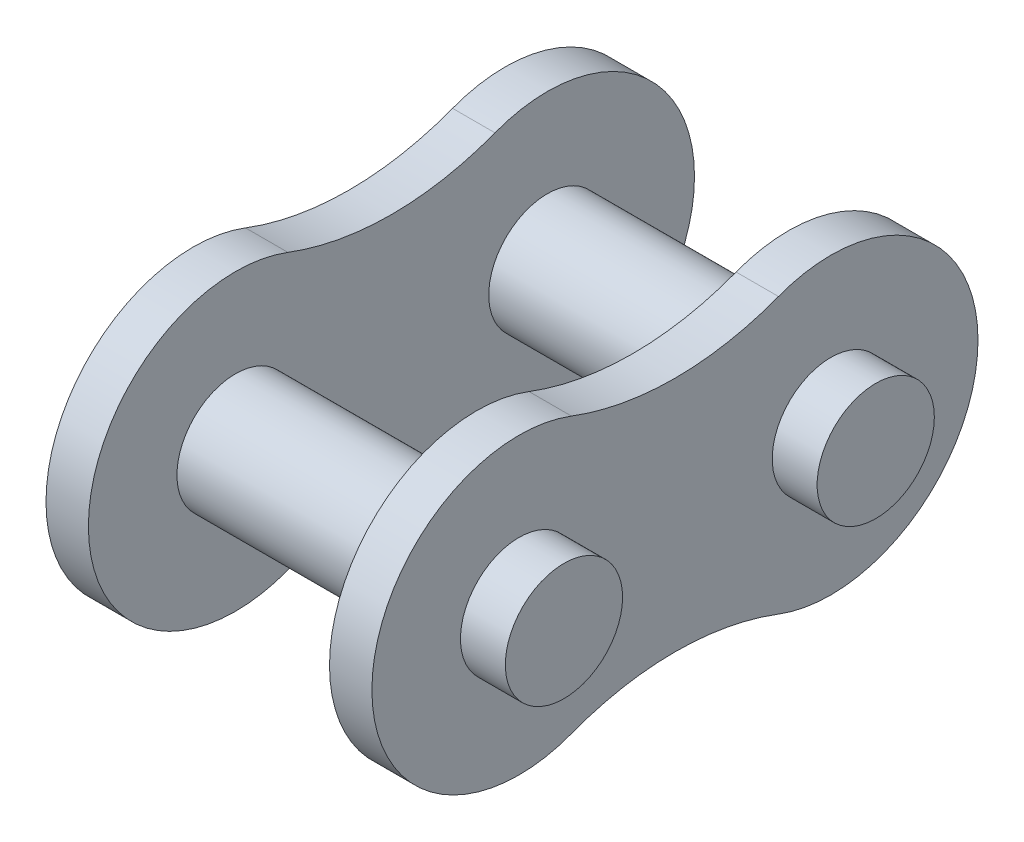
ISO-10303-21;
HEADER;
FILE_DESCRIPTION(('STEP AP214'),'2;1');
FILE_NAME('part.step','',(''),(''),'','','');
FILE_SCHEMA(('AUTOMOTIVE_DESIGN { 1 0 10303 214 1 1 1 1 }'));
ENDSEC;
DATA;
#1=APPLICATION_CONTEXT('core data for automotive mechanical design processes');
#2=APPLICATION_PROTOCOL_DEFINITION('international standard','automotive_design',2000,#1);
#3=PRODUCT_CONTEXT('',#1,'mechanical');
#4=PRODUCT('Part','Part','',(#3));
#5=PRODUCT_RELATED_PRODUCT_CATEGORY('part','',(#4));
#6=PRODUCT_DEFINITION_FORMATION('','',#4);
#7=PRODUCT_DEFINITION_CONTEXT('part definition',#1,'design');
#8=PRODUCT_DEFINITION('design','',#6,#7);
#9=PRODUCT_DEFINITION_SHAPE('','',#8);
#10=(LENGTH_UNIT() NAMED_UNIT(*) SI_UNIT(.MILLI.,.METRE.));
#11=(NAMED_UNIT(*) PLANE_ANGLE_UNIT() SI_UNIT($,.RADIAN.));
#12=(NAMED_UNIT(*) SI_UNIT($,.STERADIAN.) SOLID_ANGLE_UNIT());
#13=UNCERTAINTY_MEASURE_WITH_UNIT(LENGTH_MEASURE(1.E-05),#10,'distance_accuracy_value','');
#14=(GEOMETRIC_REPRESENTATION_CONTEXT(3) GLOBAL_UNCERTAINTY_ASSIGNED_CONTEXT((#13)) GLOBAL_UNIT_ASSIGNED_CONTEXT((#10,
#11,#12)) REPRESENTATION_CONTEXT('',''));
#15=CARTESIAN_POINT('',(0.,0.,0.));
#16=DIRECTION('',(0.,0.,1.));
#17=DIRECTION('',(1.,0.,0.));
#18=AXIS2_PLACEMENT_3D('',#15,#16,#17);
#19=CARTESIAN_POINT('',(-4.9784,0.,0.));
#20=DIRECTION('',(1.,0.,0.));
#21=DIRECTION('',(0.,0.,-1.));
#22=AXIS2_PLACEMENT_3D('',#19,#20,#21);
#23=CYLINDRICAL_SURFACE('',#22,4.4958);
#24=CARTESIAN_POINT('',(-3.683,0.,0.));
#25=DIRECTION('',(1.,0.,0.));
#26=DIRECTION('',(0.,0.,-1.));
#27=AXIS2_PLACEMENT_3D('',#24,#25,#26);
#28=CIRCLE('',#27,4.4958);
#29=CARTESIAN_POINT('',(-3.683,4.201625823671,-1.59954933586338));
#30=VERTEX_POINT('',#29);
#31=CARTESIAN_POINT('',(-3.683,-4.201625823671,-1.59954933586338));
#32=VERTEX_POINT('',#31);
#33=EDGE_CURVE('E144',#30,#32,#28,.T.);
#34=ORIENTED_EDGE('',*,*,#33,.F.);
#35=DIRECTION('',(1.,0.,0.));
#36=VECTOR('',#35,1.);
#37=CARTESIAN_POINT('',(-4.9784,4.201625823671,-1.59954933586338));
#38=LINE('',#37,#36);
#39=CARTESIAN_POINT('',(-4.9784,4.201625823671,-1.59954933586338));
#40=VERTEX_POINT('',#39);
#41=EDGE_CURVE('E13',#40,#30,#38,.T.);
#42=ORIENTED_EDGE('',*,*,#41,.F.);
#43=CARTESIAN_POINT('',(-4.9784,0.,0.));
#44=DIRECTION('',(1.,0.,0.));
#45=DIRECTION('',(0.,0.,-1.));
#46=AXIS2_PLACEMENT_3D('',#43,#44,#45);
#47=CIRCLE('',#46,4.4958);
#48=CARTESIAN_POINT('',(-4.9784,-4.201625823671,-1.59954933586338));
#49=VERTEX_POINT('',#48);
#50=EDGE_CURVE('E132',#40,#49,#47,.T.);
#51=ORIENTED_EDGE('',*,*,#50,.T.);
#52=DIRECTION('',(1.,0.,0.));
#53=VECTOR('',#52,1.);
#54=CARTESIAN_POINT('',(-4.9784,-4.201625823671,-1.59954933586338));
#55=LINE('',#54,#53);
#56=EDGE_CURVE('E75',#49,#32,#55,.T.);
#57=ORIENTED_EDGE('',*,*,#56,.T.);
#58=EDGE_LOOP('',(#34,#42,#51,#57));
#59=FACE_BOUND('',#58,.T.);
#60=ADVANCED_FACE('F72',(#59),#23,.T.);
#61=CARTESIAN_POINT('',(-4.9784,12.5099254749978,-4.7625));
#62=DIRECTION('',(1.,0.,0.));
#63=DIRECTION('',(0.,0.,-1.));
#64=AXIS2_PLACEMENT_3D('',#61,#62,#63);
#65=CYLINDRICAL_SURFACE('',#64,8.89);
#66=CARTESIAN_POINT('',(-3.683,12.5099254749978,-4.7625));
#67=DIRECTION('',(1.,0.,0.));
#68=DIRECTION('',(0.,0.,-1.));
#69=AXIS2_PLACEMENT_3D('',#66,#67,#68);
#70=CIRCLE('',#69,8.89);
#71=CARTESIAN_POINT('',(-3.683,4.201625823671,-7.92545066413662));
#72=VERTEX_POINT('',#71);
#73=EDGE_CURVE('E150',#30,#72,#70,.T.);
#74=ORIENTED_EDGE('',*,*,#73,.T.);
#75=DIRECTION('',(1.,0.,0.));
#76=VECTOR('',#75,1.);
#77=CARTESIAN_POINT('',(-4.9784,4.201625823671,-7.92545066413662));
#78=LINE('',#77,#76);
#79=CARTESIAN_POINT('',(-4.9784,4.201625823671,-7.92545066413662));
#80=VERTEX_POINT('',#79);
#81=EDGE_CURVE('E81',#80,#72,#78,.T.);
#82=ORIENTED_EDGE('',*,*,#81,.F.);
#83=CARTESIAN_POINT('',(-4.9784,12.5099254749978,-4.7625));
#84=DIRECTION('',(1.,0.,0.));
#85=DIRECTION('',(0.,0.,-1.));
#86=AXIS2_PLACEMENT_3D('',#83,#84,#85);
#87=CIRCLE('',#86,8.89);
#88=EDGE_CURVE('E129',#40,#80,#87,.T.);
#89=ORIENTED_EDGE('',*,*,#88,.F.);
#90=ORIENTED_EDGE('',*,*,#41,.T.);
#91=EDGE_LOOP('',(#74,#82,#89,#90));
#92=FACE_BOUND('',#91,.T.);
#93=ADVANCED_FACE('F172',(#92),#65,.F.);
#94=CARTESIAN_POINT('',(-4.9784,0.,-9.525));
#95=DIRECTION('',(1.,0.,0.));
#96=DIRECTION('',(0.,0.,-1.));
#97=AXIS2_PLACEMENT_3D('',#94,#95,#96);
#98=CYLINDRICAL_SURFACE('',#97,4.4958);
#99=CARTESIAN_POINT('',(-3.683,0.,-9.525));
#100=DIRECTION('',(1.,0.,0.));
#101=DIRECTION('',(0.,0.,-1.));
#102=AXIS2_PLACEMENT_3D('',#99,#100,#101);
#103=CIRCLE('',#102,4.4958);
#104=CARTESIAN_POINT('',(-3.683,-4.201625823671,-7.92545066413662));
#105=VERTEX_POINT('',#104);
#106=EDGE_CURVE('E122',#105,#72,#103,.T.);
#107=ORIENTED_EDGE('',*,*,#106,.F.);
#108=DIRECTION('',(1.,0.,0.));
#109=VECTOR('',#108,1.);
#110=CARTESIAN_POINT('',(-4.9784,-4.201625823671,-7.92545066413662));
#111=LINE('',#110,#109);
#112=CARTESIAN_POINT('',(-4.9784,-4.201625823671,-7.92545066413662));
#113=VERTEX_POINT('',#112);
#114=EDGE_CURVE('E117',#113,#105,#111,.T.);
#115=ORIENTED_EDGE('',*,*,#114,.F.);
#116=CARTESIAN_POINT('',(-4.9784,0.,-9.525));
#117=DIRECTION('',(1.,0.,0.));
#118=DIRECTION('',(0.,0.,-1.));
#119=AXIS2_PLACEMENT_3D('',#116,#117,#118);
#120=CIRCLE('',#119,4.4958);
#121=EDGE_CURVE('E120',#113,#80,#120,.T.);
#122=ORIENTED_EDGE('',*,*,#121,.T.);
#123=ORIENTED_EDGE('',*,*,#81,.T.);
#124=EDGE_LOOP('',(#107,#115,#122,#123));
#125=FACE_BOUND('',#124,.T.);
#126=ADVANCED_FACE('F119',(#125),#98,.T.);
#127=CARTESIAN_POINT('',(-4.9784,0.,-9.525));
#128=DIRECTION('',(1.,0.,0.));
#129=DIRECTION('',(0.,0.,-1.));
#130=AXIS2_PLACEMENT_3D('',#127,#128,#129);
#131=CYLINDRICAL_SURFACE('',#130,1.7907);
#132=CARTESIAN_POINT('',(-4.9784,0.,-9.525));
#133=DIRECTION('',(1.,0.,0.));
#134=DIRECTION('',(0.,0.,-1.));
#135=AXIS2_PLACEMENT_3D('',#132,#133,#134);
#136=CIRCLE('',#135,1.7907);
#137=CARTESIAN_POINT('',(-4.9784,0.,-11.3157));
#138=VERTEX_POINT('',#137);
#139=EDGE_CURVE('E138',#138,#138,#136,.T.);
#140=ORIENTED_EDGE('',*,*,#139,.F.);
#141=EDGE_LOOP('',(#140));
#142=FACE_BOUND('',#141,.T.);
#143=CARTESIAN_POINT('',(-3.683,0.,-9.525));
#144=DIRECTION('',(1.,0.,0.));
#145=DIRECTION('',(0.,0.,-1.));
#146=AXIS2_PLACEMENT_3D('',#143,#144,#145);
#147=CIRCLE('',#146,1.7907);
#148=CARTESIAN_POINT('',(-3.683,0.,-11.3157));
#149=VERTEX_POINT('',#148);
#150=EDGE_CURVE('E152',#149,#149,#147,.T.);
#151=ORIENTED_EDGE('',*,*,#150,.T.);
#152=EDGE_LOOP('',(#151));
#153=FACE_BOUND('',#152,.T.);
#154=ADVANCED_FACE('F180',(#142,#153),#131,.F.);
#155=CARTESIAN_POINT('',(-4.9784,-12.5099254749978,-4.7625));
#156=DIRECTION('',(1.,0.,0.));
#157=DIRECTION('',(0.,0.,-1.));
#158=AXIS2_PLACEMENT_3D('',#155,#156,#157);
#159=CYLINDRICAL_SURFACE('',#158,8.89);
#160=CARTESIAN_POINT('',(-3.683,-12.5099254749978,-4.7625));
#161=DIRECTION('',(1.,0.,0.));
#162=DIRECTION('',(0.,0.,-1.));
#163=AXIS2_PLACEMENT_3D('',#160,#161,#162);
#164=CIRCLE('',#163,8.89);
#165=EDGE_CURVE('E147',#32,#105,#164,.F.);
#166=ORIENTED_EDGE('',*,*,#165,.F.);
#167=ORIENTED_EDGE('',*,*,#56,.F.);
#168=CARTESIAN_POINT('',(-4.9784,-12.5099254749978,-4.7625));
#169=DIRECTION('',(1.,0.,0.));
#170=DIRECTION('',(0.,0.,-1.));
#171=AXIS2_PLACEMENT_3D('',#168,#169,#170);
#172=CIRCLE('',#171,8.89);
#173=EDGE_CURVE('E128',#49,#113,#172,.F.);
#174=ORIENTED_EDGE('',*,*,#173,.T.);
#175=ORIENTED_EDGE('',*,*,#114,.T.);
#176=EDGE_LOOP('',(#166,#167,#174,#175));
#177=FACE_BOUND('',#176,.T.);
#178=ADVANCED_FACE('F131',(#177),#159,.F.);
#179=CARTESIAN_POINT('',(-4.9784,0.,0.));
#180=DIRECTION('',(1.,0.,0.));
#181=DIRECTION('',(0.,0.,-1.));
#182=AXIS2_PLACEMENT_3D('',#179,#180,#181);
#183=CYLINDRICAL_SURFACE('',#182,1.7907);
#184=CARTESIAN_POINT('',(-4.9784,0.,0.));
#185=DIRECTION('',(1.,0.,0.));
#186=DIRECTION('',(0.,0.,-1.));
#187=AXIS2_PLACEMENT_3D('',#184,#185,#186);
#188=CIRCLE('',#187,1.7907);
#189=CARTESIAN_POINT('',(-4.9784,0.,-1.7907));
#190=VERTEX_POINT('',#189);
#191=EDGE_CURVE('E141',#190,#190,#188,.T.);
#192=ORIENTED_EDGE('',*,*,#191,.F.);
#193=EDGE_LOOP('',(#192));
#194=FACE_BOUND('',#193,.T.);
#195=CARTESIAN_POINT('',(-3.683,0.,0.));
#196=DIRECTION('',(1.,0.,0.));
#197=DIRECTION('',(0.,0.,-1.));
#198=AXIS2_PLACEMENT_3D('',#195,#196,#197);
#199=CIRCLE('',#198,1.7907);
#200=CARTESIAN_POINT('',(-3.683,0.,-1.7907));
#201=VERTEX_POINT('',#200);
#202=EDGE_CURVE('E134',#201,#201,#199,.T.);
#203=ORIENTED_EDGE('',*,*,#202,.T.);
#204=EDGE_LOOP('',(#203));
#205=FACE_BOUND('',#204,.T.);
#206=ADVANCED_FACE('F159',(#194,#205),#183,.F.);
#207=CARTESIAN_POINT('',(-4.9784,0.,0.));
#208=DIRECTION('',(1.,0.,0.));
#209=DIRECTION('',(0.,0.,-1.));
#210=AXIS2_PLACEMENT_3D('',#207,#208,#209);
#211=PLANE('',#210);
#212=ORIENTED_EDGE('',*,*,#50,.F.);
#213=ORIENTED_EDGE('',*,*,#88,.T.);
#214=ORIENTED_EDGE('',*,*,#121,.F.);
#215=ORIENTED_EDGE('',*,*,#173,.F.);
#216=EDGE_LOOP('',(#212,#213,#214,#215));
#217=FACE_BOUND('',#216,.T.);
#218=ORIENTED_EDGE('',*,*,#139,.T.);
#219=EDGE_LOOP('',(#218));
#220=FACE_BOUND('',#219,.T.);
#221=ORIENTED_EDGE('',*,*,#191,.T.);
#222=EDGE_LOOP('',(#221));
#223=FACE_BOUND('',#222,.T.);
#224=ADVANCED_FACE('F126',(#217,#220,#223),#211,.F.);
#225=CARTESIAN_POINT('',(-3.683,0.,0.));
#226=DIRECTION('',(1.,0.,0.));
#227=DIRECTION('',(0.,0.,-1.));
#228=AXIS2_PLACEMENT_3D('',#225,#226,#227);
#229=PLANE('',#228);
#230=ORIENTED_EDGE('',*,*,#33,.T.);
#231=ORIENTED_EDGE('',*,*,#165,.T.);
#232=ORIENTED_EDGE('',*,*,#106,.T.);
#233=ORIENTED_EDGE('',*,*,#73,.F.);
#234=EDGE_LOOP('',(#230,#231,#232,#233));
#235=FACE_BOUND('',#234,.T.);
#236=ORIENTED_EDGE('',*,*,#150,.F.);
#237=EDGE_LOOP('',(#236));
#238=FACE_BOUND('',#237,.T.);
#239=ORIENTED_EDGE('',*,*,#202,.F.);
#240=EDGE_LOOP('',(#239));
#241=FACE_BOUND('',#240,.T.);
#242=ADVANCED_FACE('F161',(#235,#238,#241),#229,.T.);
#243=CLOSED_SHELL('',(#60,#93,#126,#154,#178,#206,#224,#242));
#244=MANIFOLD_SOLID_BREP('B2',#243);
#245=CARTESIAN_POINT('',(3.683,0.,0.));
#246=DIRECTION('',(1.,0.,0.));
#247=DIRECTION('',(0.,0.,-1.));
#248=AXIS2_PLACEMENT_3D('',#245,#246,#247);
#249=PLANE('',#248);
#250=CARTESIAN_POINT('',(3.683,0.,0.));
#251=DIRECTION('',(1.,0.,0.));
#252=DIRECTION('',(0.,0.,-1.));
#253=AXIS2_PLACEMENT_3D('',#250,#251,#252);
#254=CIRCLE('',#253,4.4958);
#255=CARTESIAN_POINT('',(3.683,4.201625823671,-1.59954933586338));
#256=VERTEX_POINT('',#255);
#257=CARTESIAN_POINT('',(3.683,-4.201625823671,-1.59954933586338));
#258=VERTEX_POINT('',#257);
#259=EDGE_CURVE('E322',#256,#258,#254,.T.);
#260=ORIENTED_EDGE('',*,*,#259,.F.);
#261=CARTESIAN_POINT('',(3.683,12.5099254749978,-4.7625));
#262=DIRECTION('',(1.,0.,0.));
#263=DIRECTION('',(0.,0.,-1.));
#264=AXIS2_PLACEMENT_3D('',#261,#262,#263);
#265=CIRCLE('',#264,8.89);
#266=CARTESIAN_POINT('',(3.683,4.201625823671,-7.92545066413662));
#267=VERTEX_POINT('',#266);
#268=EDGE_CURVE('E327',#256,#267,#265,.T.);
#269=ORIENTED_EDGE('',*,*,#268,.T.);
#270=CARTESIAN_POINT('',(3.683,0.,-9.525));
#271=DIRECTION('',(1.,0.,0.));
#272=DIRECTION('',(0.,0.,-1.));
#273=AXIS2_PLACEMENT_3D('',#270,#271,#272);
#274=CIRCLE('',#273,4.4958);
#275=CARTESIAN_POINT('',(3.683,-4.201625823671,-7.92545066413662));
#276=VERTEX_POINT('',#275);
#277=EDGE_CURVE('E325',#276,#267,#274,.T.);
#278=ORIENTED_EDGE('',*,*,#277,.F.);
#279=CARTESIAN_POINT('',(3.683,-12.5099254749978,-4.7625));
#280=DIRECTION('',(1.,0.,0.));
#281=DIRECTION('',(0.,0.,-1.));
#282=AXIS2_PLACEMENT_3D('',#279,#280,#281);
#283=CIRCLE('',#282,8.89);
#284=EDGE_CURVE('E313',#258,#276,#283,.F.);
#285=ORIENTED_EDGE('',*,*,#284,.F.);
#286=EDGE_LOOP('',(#260,#269,#278,#285));
#287=FACE_BOUND('',#286,.T.);
#288=ADVANCED_FACE('F258',(#287),#249,.F.);
#289=CARTESIAN_POINT('',(4.9784,0.,-9.525));
#290=DIRECTION('',(-1.,0.,0.));
#291=DIRECTION('',(0.,0.,1.));
#292=AXIS2_PLACEMENT_3D('',#289,#290,#291);
#293=CYLINDRICAL_SURFACE('',#292,4.4958);
#294=ORIENTED_EDGE('',*,*,#277,.T.);
#295=DIRECTION('',(-1.,0.,0.));
#296=VECTOR('',#295,1.);
#297=CARTESIAN_POINT('',(4.9784,4.201625823671,-7.92545066413662));
#298=LINE('',#297,#296);
#299=CARTESIAN_POINT('',(4.9784,4.201625823671,-7.92545066413662));
#300=VERTEX_POINT('',#299);
#301=EDGE_CURVE('E290',#300,#267,#298,.T.);
#302=ORIENTED_EDGE('',*,*,#301,.F.);
#303=CARTESIAN_POINT('',(4.9784,0.,-9.525));
#304=DIRECTION('',(1.,0.,0.));
#305=DIRECTION('',(0.,0.,-1.));
#306=AXIS2_PLACEMENT_3D('',#303,#304,#305);
#307=CIRCLE('',#306,4.4958);
#308=CARTESIAN_POINT('',(4.9784,-4.201625823671,-7.92545066413662));
#309=VERTEX_POINT('',#308);
#310=EDGE_CURVE('E307',#309,#300,#307,.T.);
#311=ORIENTED_EDGE('',*,*,#310,.F.);
#312=DIRECTION('',(-1.,0.,0.));
#313=VECTOR('',#312,1.);
#314=CARTESIAN_POINT('',(4.9784,-4.201625823671,-7.92545066413662));
#315=LINE('',#314,#313);
#316=EDGE_CURVE('E267',#309,#276,#315,.T.);
#317=ORIENTED_EDGE('',*,*,#316,.T.);
#318=EDGE_LOOP('',(#294,#302,#311,#317));
#319=FACE_BOUND('',#318,.T.);
#320=ADVANCED_FACE('F316',(#319),#293,.T.);
#321=CARTESIAN_POINT('',(4.9784,-12.5099254749978,-4.7625));
#322=DIRECTION('',(-1.,0.,0.));
#323=DIRECTION('',(0.,0.,1.));
#324=AXIS2_PLACEMENT_3D('',#321,#322,#323);
#325=CYLINDRICAL_SURFACE('',#324,8.89);
#326=ORIENTED_EDGE('',*,*,#284,.T.);
#327=ORIENTED_EDGE('',*,*,#316,.F.);
#328=CARTESIAN_POINT('',(4.9784,-12.5099254749978,-4.7625));
#329=DIRECTION('',(1.,0.,0.));
#330=DIRECTION('',(0.,0.,-1.));
#331=AXIS2_PLACEMENT_3D('',#328,#329,#330);
#332=CIRCLE('',#331,8.89);
#333=CARTESIAN_POINT('',(4.9784,-4.201625823671,-1.59954933586338));
#334=VERTEX_POINT('',#333);
#335=EDGE_CURVE('E301',#334,#309,#332,.F.);
#336=ORIENTED_EDGE('',*,*,#335,.F.);
#337=DIRECTION('',(-1.,0.,0.));
#338=VECTOR('',#337,1.);
#339=CARTESIAN_POINT('',(4.9784,-4.201625823671,-1.59954933586338));
#340=LINE('',#339,#338);
#341=EDGE_CURVE('E70',#334,#258,#340,.T.);
#342=ORIENTED_EDGE('',*,*,#341,.T.);
#343=EDGE_LOOP('',(#326,#327,#336,#342));
#344=FACE_BOUND('',#343,.T.);
#345=ADVANCED_FACE('F312',(#344),#325,.F.);
#346=CARTESIAN_POINT('',(4.9784,0.,0.));
#347=DIRECTION('',(-1.,0.,0.));
#348=DIRECTION('',(0.,0.,1.));
#349=AXIS2_PLACEMENT_3D('',#346,#347,#348);
#350=CYLINDRICAL_SURFACE('',#349,4.4958);
#351=ORIENTED_EDGE('',*,*,#259,.T.);
#352=ORIENTED_EDGE('',*,*,#341,.F.);
#353=CARTESIAN_POINT('',(4.9784,0.,0.));
#354=DIRECTION('',(1.,0.,0.));
#355=DIRECTION('',(0.,0.,-1.));
#356=AXIS2_PLACEMENT_3D('',#353,#354,#355);
#357=CIRCLE('',#356,4.4958);
#358=CARTESIAN_POINT('',(4.9784,4.201625823671,-1.59954933586338));
#359=VERTEX_POINT('',#358);
#360=EDGE_CURVE('E308',#359,#334,#357,.T.);
#361=ORIENTED_EDGE('',*,*,#360,.F.);
#362=DIRECTION('',(-1.,0.,0.));
#363=VECTOR('',#362,1.);
#364=CARTESIAN_POINT('',(4.9784,4.201625823671,-1.59954933586338));
#365=LINE('',#364,#363);
#366=EDGE_CURVE('E275',#359,#256,#365,.T.);
#367=ORIENTED_EDGE('',*,*,#366,.T.);
#368=EDGE_LOOP('',(#351,#352,#361,#367));
#369=FACE_BOUND('',#368,.T.);
#370=ADVANCED_FACE('F260',(#369),#350,.T.);
#371=CARTESIAN_POINT('',(4.9784,12.5099254749978,-4.7625));
#372=DIRECTION('',(-1.,0.,0.));
#373=DIRECTION('',(0.,0.,1.));
#374=AXIS2_PLACEMENT_3D('',#371,#372,#373);
#375=CYLINDRICAL_SURFACE('',#374,8.89);
#376=ORIENTED_EDGE('',*,*,#268,.F.);
#377=ORIENTED_EDGE('',*,*,#366,.F.);
#378=CARTESIAN_POINT('',(4.9784,12.5099254749978,-4.7625));
#379=DIRECTION('',(1.,0.,0.));
#380=DIRECTION('',(0.,0.,-1.));
#381=AXIS2_PLACEMENT_3D('',#378,#379,#380);
#382=CIRCLE('',#381,8.89);
#383=EDGE_CURVE('E317',#359,#300,#382,.T.);
#384=ORIENTED_EDGE('',*,*,#383,.T.);
#385=ORIENTED_EDGE('',*,*,#301,.T.);
#386=EDGE_LOOP('',(#376,#377,#384,#385));
#387=FACE_BOUND('',#386,.T.);
#388=ADVANCED_FACE('F332',(#387),#375,.F.);
#389=CARTESIAN_POINT('',(4.9784,0.,0.));
#390=DIRECTION('',(1.,0.,0.));
#391=DIRECTION('',(0.,0.,-1.));
#392=AXIS2_PLACEMENT_3D('',#389,#390,#391);
#393=PLANE('',#392);
#394=ORIENTED_EDGE('',*,*,#360,.T.);
#395=ORIENTED_EDGE('',*,*,#335,.T.);
#396=ORIENTED_EDGE('',*,*,#310,.T.);
#397=ORIENTED_EDGE('',*,*,#383,.F.);
#398=EDGE_LOOP('',(#394,#395,#396,#397));
#399=FACE_BOUND('',#398,.T.);
#400=ADVANCED_FACE('F304',(#399),#393,.T.);
#401=CLOSED_SHELL('',(#288,#320,#345,#370,#388,#400));
#402=MANIFOLD_SOLID_BREP('B7',#401);
#403=CARTESIAN_POINT('',(6.35,0.,0.));
#404=DIRECTION('',(-1.,0.,0.));
#405=DIRECTION('',(0.,0.,1.));
#406=AXIS2_PLACEMENT_3D('',#403,#404,#405);
#407=CYLINDRICAL_SURFACE('',#406,1.7907);
#408=CARTESIAN_POINT('',(6.35,0.,0.));
#409=DIRECTION('',(1.,0.,0.));
#410=DIRECTION('',(0.,0.,-1.));
#411=AXIS2_PLACEMENT_3D('',#408,#409,#410);
#412=CIRCLE('',#411,1.7907);
#413=CARTESIAN_POINT('',(6.35,0.,-1.7907));
#414=VERTEX_POINT('',#413);
#415=EDGE_CURVE('E257',#414,#414,#412,.T.);
#416=ORIENTED_EDGE('',*,*,#415,.F.);
#417=EDGE_LOOP('',(#416));
#418=FACE_BOUND('',#417,.T.);
#419=CARTESIAN_POINT('',(-6.35,0.,0.));
#420=DIRECTION('',(1.,0.,0.));
#421=DIRECTION('',(0.,0.,-1.));
#422=AXIS2_PLACEMENT_3D('',#419,#420,#421);
#423=CIRCLE('',#422,1.7907);
#424=CARTESIAN_POINT('',(-6.35,0.,-1.7907));
#425=VERTEX_POINT('',#424);
#426=EDGE_CURVE('E422',#425,#425,#423,.T.);
#427=ORIENTED_EDGE('',*,*,#426,.T.);
#428=EDGE_LOOP('',(#427));
#429=FACE_BOUND('',#428,.T.);
#430=ADVANCED_FACE('F419',(#418,#429),#407,.T.);
#431=CARTESIAN_POINT('',(6.35,0.,0.));
#432=DIRECTION('',(1.,0.,0.));
#433=DIRECTION('',(0.,0.,-1.));
#434=AXIS2_PLACEMENT_3D('',#431,#432,#433);
#435=PLANE('',#434);
#436=ORIENTED_EDGE('',*,*,#415,.T.);
#437=EDGE_LOOP('',(#436));
#438=FACE_BOUND('',#437,.T.);
#439=ADVANCED_FACE('F434',(#438),#435,.T.);
#440=CARTESIAN_POINT('',(-6.35,0.,0.));
#441=DIRECTION('',(1.,0.,0.));
#442=DIRECTION('',(0.,0.,-1.));
#443=AXIS2_PLACEMENT_3D('',#440,#441,#442);
#444=PLANE('',#443);
#445=ORIENTED_EDGE('',*,*,#426,.F.);
#446=EDGE_LOOP('',(#445));
#447=FACE_BOUND('',#446,.T.);
#448=ADVANCED_FACE('F432',(#447),#444,.F.);
#449=CLOSED_SHELL('',(#430,#439,#448));
#450=MANIFOLD_SOLID_BREP('B64',#449);
#451=CARTESIAN_POINT('',(6.35,0.,-9.525));
#452=DIRECTION('',(-1.,0.,0.));
#453=DIRECTION('',(0.,0.,1.));
#454=AXIS2_PLACEMENT_3D('',#451,#452,#453);
#455=CYLINDRICAL_SURFACE('',#454,1.7907);
#456=CARTESIAN_POINT('',(6.35,0.,-9.525));
#457=DIRECTION('',(1.,0.,0.));
#458=DIRECTION('',(0.,0.,-1.));
#459=AXIS2_PLACEMENT_3D('',#456,#457,#458);
#460=CIRCLE('',#459,1.7907);
#461=CARTESIAN_POINT('',(6.35,0.,-11.3157));
#462=VERTEX_POINT('',#461);
#463=EDGE_CURVE('E418',#462,#462,#460,.T.);
#464=ORIENTED_EDGE('',*,*,#463,.F.);
#465=EDGE_LOOP('',(#464));
#466=FACE_BOUND('',#465,.T.);
#467=CARTESIAN_POINT('',(-6.35,0.,-9.525));
#468=DIRECTION('',(1.,0.,0.));
#469=DIRECTION('',(0.,0.,-1.));
#470=AXIS2_PLACEMENT_3D('',#467,#468,#469);
#471=CIRCLE('',#470,1.7907);
#472=CARTESIAN_POINT('',(-6.35,0.,-11.3157));
#473=VERTEX_POINT('',#472);
#474=EDGE_CURVE('E463',#473,#473,#471,.T.);
#475=ORIENTED_EDGE('',*,*,#474,.T.);
#476=EDGE_LOOP('',(#475));
#477=FACE_BOUND('',#476,.T.);
#478=ADVANCED_FACE('F460',(#466,#477),#455,.T.);
#479=CARTESIAN_POINT('',(6.35,0.,0.));
#480=DIRECTION('',(1.,0.,0.));
#481=DIRECTION('',(0.,0.,-1.));
#482=AXIS2_PLACEMENT_3D('',#479,#480,#481);
#483=PLANE('',#482);
#484=ORIENTED_EDGE('',*,*,#463,.T.);
#485=EDGE_LOOP('',(#484));
#486=FACE_BOUND('',#485,.T.);
#487=ADVANCED_FACE('F475',(#486),#483,.T.);
#488=CARTESIAN_POINT('',(-6.35,0.,0.));
#489=DIRECTION('',(1.,0.,0.));
#490=DIRECTION('',(0.,0.,-1.));
#491=AXIS2_PLACEMENT_3D('',#488,#489,#490);
#492=PLANE('',#491);
#493=ORIENTED_EDGE('',*,*,#474,.F.);
#494=EDGE_LOOP('',(#493));
#495=FACE_BOUND('',#494,.T.);
#496=ADVANCED_FACE('F473',(#495),#492,.F.);
#497=CLOSED_SHELL('',(#478,#487,#496));
#498=MANIFOLD_SOLID_BREP('B252',#497);
#499=ADVANCED_BREP_SHAPE_REPRESENTATION('',(#18,#244,#402,#450,#498),#14);
#500=SHAPE_DEFINITION_REPRESENTATION(#9,#499);
ENDSEC;
END-ISO-10303-21;
